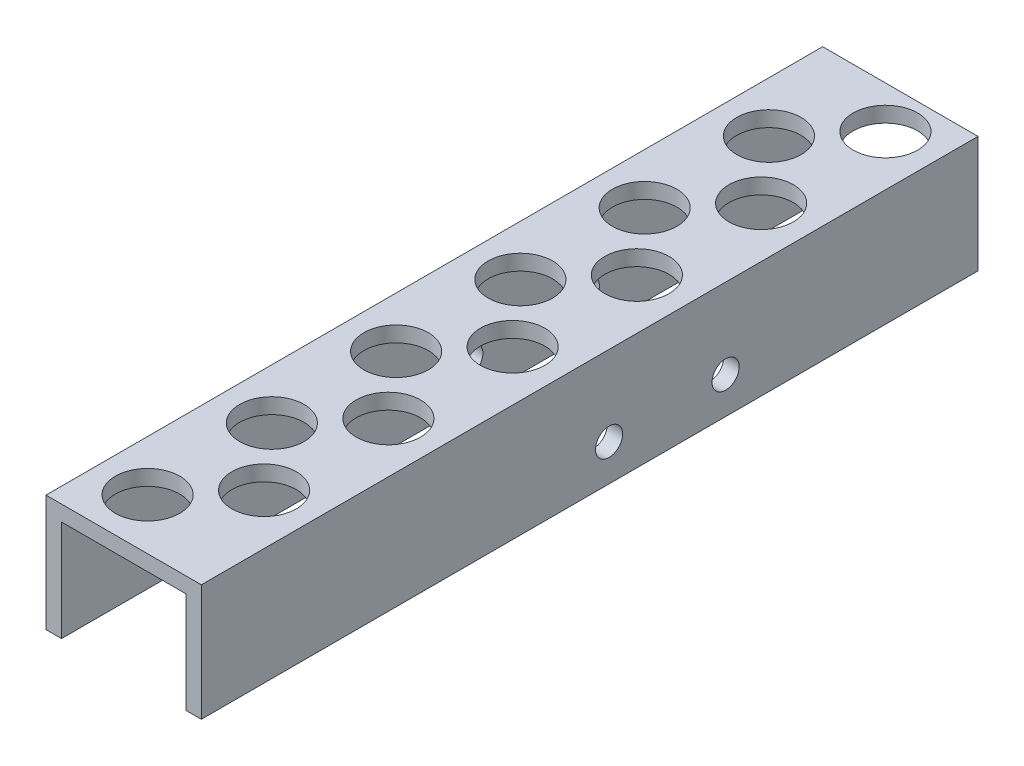
ISO-10303-21;
HEADER;
FILE_DESCRIPTION(('STEP AP214'),'2;1');
FILE_NAME('part.step','',(''),(''),'','','');
FILE_SCHEMA(('AUTOMOTIVE_DESIGN { 1 0 10303 214 1 1 1 1 }'));
ENDSEC;
DATA;
#1=APPLICATION_CONTEXT('core data for automotive mechanical design processes');
#2=APPLICATION_PROTOCOL_DEFINITION('international standard','automotive_design',2000,#1);
#3=PRODUCT_CONTEXT('',#1,'mechanical');
#4=PRODUCT('Part','Part','',(#3));
#5=PRODUCT_RELATED_PRODUCT_CATEGORY('part','',(#4));
#6=PRODUCT_DEFINITION_FORMATION('','',#4);
#7=PRODUCT_DEFINITION_CONTEXT('part definition',#1,'design');
#8=PRODUCT_DEFINITION('design','',#6,#7);
#9=PRODUCT_DEFINITION_SHAPE('','',#8);
#10=(LENGTH_UNIT() NAMED_UNIT(*) SI_UNIT(.MILLI.,.METRE.));
#11=(NAMED_UNIT(*) PLANE_ANGLE_UNIT() SI_UNIT($,.RADIAN.));
#12=(NAMED_UNIT(*) SI_UNIT($,.STERADIAN.) SOLID_ANGLE_UNIT());
#13=UNCERTAINTY_MEASURE_WITH_UNIT(LENGTH_MEASURE(1.E-05),#10,'distance_accuracy_value','');
#14=(GEOMETRIC_REPRESENTATION_CONTEXT(3) GLOBAL_UNCERTAINTY_ASSIGNED_CONTEXT((#13)) GLOBAL_UNIT_ASSIGNED_CONTEXT((#10,
#11,#12)) REPRESENTATION_CONTEXT('',''));
#15=CARTESIAN_POINT('',(0.,0.,0.));
#16=DIRECTION('',(0.,0.,1.));
#17=DIRECTION('',(1.,0.,0.));
#18=AXIS2_PLACEMENT_3D('',#15,#16,#17);
#19=CARTESIAN_POINT('',(-10.,-7.5,100.));
#20=DIRECTION('',(0.,1.,0.));
#21=DIRECTION('',(0.,0.,1.));
#22=AXIS2_PLACEMENT_3D('',#19,#20,#21);
#23=PLANE('',#22);
#24=DIRECTION('',(1.,0.,0.));
#25=VECTOR('',#24,1.);
#26=CARTESIAN_POINT('',(-10.,-7.5,100.));
#27=LINE('',#26,#25);
#28=CARTESIAN_POINT('',(8.,-7.5,100.));
#29=VERTEX_POINT('',#28);
#30=CARTESIAN_POINT('',(10.,-7.5,100.));
#31=VERTEX_POINT('',#30);
#32=EDGE_CURVE('E59',#29,#31,#27,.T.);
#33=ORIENTED_EDGE('',*,*,#32,.F.);
#34=DIRECTION('',(0.,0.,-1.));
#35=VECTOR('',#34,1.);
#36=CARTESIAN_POINT('',(8.,-7.5,100.));
#37=LINE('',#36,#35);
#38=CARTESIAN_POINT('',(8.,-7.5,0.));
#39=VERTEX_POINT('',#38);
#40=EDGE_CURVE('E110',#29,#39,#37,.T.);
#41=ORIENTED_EDGE('',*,*,#40,.T.);
#42=DIRECTION('',(1.,0.,0.));
#43=VECTOR('',#42,1.);
#44=CARTESIAN_POINT('',(-10.,-7.5,0.));
#45=LINE('',#44,#43);
#46=CARTESIAN_POINT('',(10.,-7.5,0.));
#47=VERTEX_POINT('',#46);
#48=EDGE_CURVE('E81',#39,#47,#45,.T.);
#49=ORIENTED_EDGE('',*,*,#48,.T.);
#50=DIRECTION('',(0.,0.,-1.));
#51=VECTOR('',#50,1.);
#52=CARTESIAN_POINT('',(10.,-7.5,100.));
#53=LINE('',#52,#51);
#54=EDGE_CURVE('E124',#31,#47,#53,.T.);
#55=ORIENTED_EDGE('',*,*,#54,.F.);
#56=EDGE_LOOP('',(#33,#41,#49,#55));
#57=FACE_BOUND('',#56,.T.);
#58=ADVANCED_FACE('F33',(#57),#23,.F.);
#59=CARTESIAN_POINT('',(10.,-7.5,100.));
#60=DIRECTION('',(-1.,0.,0.));
#61=DIRECTION('',(0.,0.,1.));
#62=AXIS2_PLACEMENT_3D('',#59,#60,#61);
#63=PLANE('',#62);
#64=CARTESIAN_POINT('',(10.,-2.8,47.5));
#65=DIRECTION('',(-1.,0.,0.));
#66=DIRECTION('',(0.,0.,1.));
#67=AXIS2_PLACEMENT_3D('',#64,#65,#66);
#68=CIRCLE('',#67,1.75);
#69=CARTESIAN_POINT('',(10.,-2.8,49.25));
#70=VERTEX_POINT('',#69);
#71=EDGE_CURVE('E160',#70,#70,#68,.T.);
#72=ORIENTED_EDGE('',*,*,#71,.T.);
#73=EDGE_LOOP('',(#72));
#74=FACE_BOUND('',#73,.T.);
#75=CARTESIAN_POINT('',(10.,-2.8,32.5));
#76=DIRECTION('',(-1.,0.,0.));
#77=DIRECTION('',(0.,0.,1.));
#78=AXIS2_PLACEMENT_3D('',#75,#76,#77);
#79=CIRCLE('',#78,1.75);
#80=CARTESIAN_POINT('',(10.,-2.8,34.25));
#81=VERTEX_POINT('',#80);
#82=EDGE_CURVE('E157',#81,#81,#79,.T.);
#83=ORIENTED_EDGE('',*,*,#82,.T.);
#84=EDGE_LOOP('',(#83));
#85=FACE_BOUND('',#84,.T.);
#86=DIRECTION('',(0.,1.,0.));
#87=VECTOR('',#86,1.);
#88=CARTESIAN_POINT('',(10.,-7.5,0.));
#89=LINE('',#88,#87);
#90=CARTESIAN_POINT('',(10.,7.5,0.));
#91=VERTEX_POINT('',#90);
#92=EDGE_CURVE('E133',#47,#91,#89,.T.);
#93=ORIENTED_EDGE('',*,*,#92,.T.);
#94=DIRECTION('',(0.,0.,-1.));
#95=VECTOR('',#94,1.);
#96=CARTESIAN_POINT('',(10.,7.5,100.));
#97=LINE('',#96,#95);
#98=CARTESIAN_POINT('',(10.,7.5,100.));
#99=VERTEX_POINT('',#98);
#100=EDGE_CURVE('E11',#99,#91,#97,.T.);
#101=ORIENTED_EDGE('',*,*,#100,.F.);
#102=DIRECTION('',(0.,1.,0.));
#103=VECTOR('',#102,1.);
#104=CARTESIAN_POINT('',(10.,-7.5,100.));
#105=LINE('',#104,#103);
#106=EDGE_CURVE('E144',#31,#99,#105,.T.);
#107=ORIENTED_EDGE('',*,*,#106,.F.);
#108=ORIENTED_EDGE('',*,*,#54,.T.);
#109=EDGE_LOOP('',(#93,#101,#107,#108));
#110=FACE_BOUND('',#109,.T.);
#111=ADVANCED_FACE('F35',(#74,#85,#110),#63,.F.);
#112=CARTESIAN_POINT('',(-10.,7.5,100.));
#113=DIRECTION('',(0.,-1.,0.));
#114=DIRECTION('',(0.,0.,-1.));
#115=AXIS2_PLACEMENT_3D('',#112,#113,#114);
#116=PLANE('',#115);
#117=CARTESIAN_POINT('',(-3.4999999999995,7.5,61.4191280685343));
#118=DIRECTION('',(0.,1.,0.));
#119=DIRECTION('',(0.,0.,1.));
#120=AXIS2_PLACEMENT_3D('',#117,#118,#119);
#121=CIRCLE('',#120,4.15);
#122=CARTESIAN_POINT('',(-3.4999999999995,7.5,65.5691280685343));
#123=VERTEX_POINT('',#122);
#124=EDGE_CURVE('E193',#123,#123,#121,.T.);
#125=ORIENTED_EDGE('',*,*,#124,.F.);
#126=EDGE_LOOP('',(#125));
#127=FACE_BOUND('',#126,.T.);
#128=CARTESIAN_POINT('',(3.50000000000067,7.5,69.4191280685343));
#129=DIRECTION('',(0.,1.,0.));
#130=DIRECTION('',(0.,0.,1.));
#131=AXIS2_PLACEMENT_3D('',#128,#129,#130);
#132=CIRCLE('',#131,4.15);
#133=CARTESIAN_POINT('',(3.50000000000067,7.5,73.5691280685343));
#134=VERTEX_POINT('',#133);
#135=EDGE_CURVE('E187',#134,#134,#132,.T.);
#136=ORIENTED_EDGE('',*,*,#135,.F.);
#137=EDGE_LOOP('',(#136));
#138=FACE_BOUND('',#137,.T.);
#139=CARTESIAN_POINT('',(3.5000000000005,7.5,53.4191280685343));
#140=DIRECTION('',(0.,1.,0.));
#141=DIRECTION('',(0.,0.,1.));
#142=AXIS2_PLACEMENT_3D('',#139,#140,#141);
#143=CIRCLE('',#142,4.15);
#144=CARTESIAN_POINT('',(3.5000000000005,7.5,57.5691280685343));
#145=VERTEX_POINT('',#144);
#146=EDGE_CURVE('E199',#145,#145,#143,.T.);
#147=ORIENTED_EDGE('',*,*,#146,.F.);
#148=EDGE_LOOP('',(#147));
#149=FACE_BOUND('',#148,.T.);
#150=CARTESIAN_POINT('',(3.50000000000083,7.5,85.4191280685343));
#151=DIRECTION('',(0.,1.,0.));
#152=DIRECTION('',(0.,0.,1.));
#153=AXIS2_PLACEMENT_3D('',#150,#151,#152);
#154=CIRCLE('',#153,4.15);
#155=CARTESIAN_POINT('',(3.50000000000083,7.5,89.5691280685343));
#156=VERTEX_POINT('',#155);
#157=EDGE_CURVE('E175',#156,#156,#154,.T.);
#158=ORIENTED_EDGE('',*,*,#157,.F.);
#159=EDGE_LOOP('',(#158));
#160=FACE_BOUND('',#159,.T.);
#161=CARTESIAN_POINT('',(-3.49999999999917,7.5,93.4191280685343));
#162=DIRECTION('',(0.,1.,0.));
#163=DIRECTION('',(0.,0.,1.));
#164=AXIS2_PLACEMENT_3D('',#161,#162,#163);
#165=CIRCLE('',#164,4.15);
#166=CARTESIAN_POINT('',(-3.49999999999917,7.5,97.5691280685343));
#167=VERTEX_POINT('',#166);
#168=EDGE_CURVE('E171',#167,#167,#165,.T.);
#169=ORIENTED_EDGE('',*,*,#168,.F.);
#170=EDGE_LOOP('',(#169));
#171=FACE_BOUND('',#170,.T.);
#172=CARTESIAN_POINT('',(-3.49999999999933,7.5,77.4191280685343));
#173=DIRECTION('',(0.,1.,0.));
#174=DIRECTION('',(0.,0.,1.));
#175=AXIS2_PLACEMENT_3D('',#172,#173,#174);
#176=CIRCLE('',#175,4.15);
#177=CARTESIAN_POINT('',(-3.49999999999933,7.5,81.5691280685343));
#178=VERTEX_POINT('',#177);
#179=EDGE_CURVE('E181',#178,#178,#176,.T.);
#180=ORIENTED_EDGE('',*,*,#179,.F.);
#181=EDGE_LOOP('',(#180));
#182=FACE_BOUND('',#181,.T.);
#183=CARTESIAN_POINT('',(3.50000000000016,7.5,21.4191280685343));
#184=DIRECTION('',(0.,1.,0.));
#185=DIRECTION('',(0.,0.,1.));
#186=AXIS2_PLACEMENT_3D('',#183,#184,#185);
#187=CIRCLE('',#186,4.15);
#188=CARTESIAN_POINT('',(3.50000000000016,7.5,25.5691280685343));
#189=VERTEX_POINT('',#188);
#190=EDGE_CURVE('E223',#189,#189,#187,.T.);
#191=ORIENTED_EDGE('',*,*,#190,.F.);
#192=EDGE_LOOP('',(#191));
#193=FACE_BOUND('',#192,.T.);
#194=CARTESIAN_POINT('',(-3.5,7.5,13.4191280685343));
#195=DIRECTION('',(0.,1.,0.));
#196=DIRECTION('',(0.,0.,1.));
#197=AXIS2_PLACEMENT_3D('',#194,#195,#196);
#198=CIRCLE('',#197,4.15);
#199=CARTESIAN_POINT('',(-3.5,7.5,17.5691280685343));
#200=VERTEX_POINT('',#199);
#201=EDGE_CURVE('E229',#200,#200,#198,.T.);
#202=ORIENTED_EDGE('',*,*,#201,.F.);
#203=EDGE_LOOP('',(#202));
#204=FACE_BOUND('',#203,.T.);
#205=CARTESIAN_POINT('',(3.50000000000033,7.5,37.4191280685343));
#206=DIRECTION('',(0.,1.,0.));
#207=DIRECTION('',(0.,0.,1.));
#208=AXIS2_PLACEMENT_3D('',#205,#206,#207);
#209=CIRCLE('',#208,4.15);
#210=CARTESIAN_POINT('',(3.50000000000033,7.5,41.5691280685343));
#211=VERTEX_POINT('',#210);
#212=EDGE_CURVE('E211',#211,#211,#209,.T.);
#213=ORIENTED_EDGE('',*,*,#212,.F.);
#214=EDGE_LOOP('',(#213));
#215=FACE_BOUND('',#214,.T.);
#216=CARTESIAN_POINT('',(-3.49999999999967,7.5,45.4191280685343));
#217=DIRECTION('',(0.,1.,0.));
#218=DIRECTION('',(0.,0.,1.));
#219=AXIS2_PLACEMENT_3D('',#216,#217,#218);
#220=CIRCLE('',#219,4.15);
#221=CARTESIAN_POINT('',(-3.49999999999967,7.5,49.5691280685343));
#222=VERTEX_POINT('',#221);
#223=EDGE_CURVE('E205',#222,#222,#220,.T.);
#224=ORIENTED_EDGE('',*,*,#223,.F.);
#225=EDGE_LOOP('',(#224));
#226=FACE_BOUND('',#225,.T.);
#227=CARTESIAN_POINT('',(-3.49999999999984,7.5,29.4191280685343));
#228=DIRECTION('',(0.,1.,0.));
#229=DIRECTION('',(0.,0.,1.));
#230=AXIS2_PLACEMENT_3D('',#227,#228,#229);
#231=CIRCLE('',#230,4.15);
#232=CARTESIAN_POINT('',(-3.49999999999984,7.5,33.5691280685343));
#233=VERTEX_POINT('',#232);
#234=EDGE_CURVE('E217',#233,#233,#231,.T.);
#235=ORIENTED_EDGE('',*,*,#234,.F.);
#236=EDGE_LOOP('',(#235));
#237=FACE_BOUND('',#236,.T.);
#238=CARTESIAN_POINT('',(3.5,7.5,5.41912806853429));
#239=DIRECTION('',(0.,1.,0.));
#240=DIRECTION('',(0.,0.,1.));
#241=AXIS2_PLACEMENT_3D('',#238,#239,#240);
#242=CIRCLE('',#241,4.15);
#243=CARTESIAN_POINT('',(3.5,7.5,9.56912806853429));
#244=VERTEX_POINT('',#243);
#245=EDGE_CURVE('E235',#244,#244,#242,.T.);
#246=ORIENTED_EDGE('',*,*,#245,.F.);
#247=EDGE_LOOP('',(#246));
#248=FACE_BOUND('',#247,.T.);
#249=DIRECTION('',(-1.,0.,0.));
#250=VECTOR('',#249,1.);
#251=CARTESIAN_POINT('',(-10.,7.5,0.));
#252=LINE('',#251,#250);
#253=CARTESIAN_POINT('',(-10.,7.5,0.));
#254=VERTEX_POINT('',#253);
#255=EDGE_CURVE('E136',#91,#254,#252,.T.);
#256=ORIENTED_EDGE('',*,*,#255,.T.);
#257=DIRECTION('',(0.,0.,-1.));
#258=VECTOR('',#257,1.);
#259=CARTESIAN_POINT('',(-10.,7.5,100.));
#260=LINE('',#259,#258);
#261=CARTESIAN_POINT('',(-10.,7.5,100.));
#262=VERTEX_POINT('',#261);
#263=EDGE_CURVE('E42',#262,#254,#260,.T.);
#264=ORIENTED_EDGE('',*,*,#263,.F.);
#265=DIRECTION('',(-1.,0.,0.));
#266=VECTOR('',#265,1.);
#267=CARTESIAN_POINT('',(-10.,7.5,100.));
#268=LINE('',#267,#266);
#269=EDGE_CURVE('E88',#99,#262,#268,.T.);
#270=ORIENTED_EDGE('',*,*,#269,.F.);
#271=ORIENTED_EDGE('',*,*,#100,.T.);
#272=EDGE_LOOP('',(#256,#264,#270,#271));
#273=FACE_BOUND('',#272,.T.);
#274=ADVANCED_FACE('F257',(#127,#138,#149,#160,#171,#182,#193,#204,#215,#226,#237,#248,#273),
#116,.F.);
#275=CARTESIAN_POINT('',(-10.,-7.5,100.));
#276=DIRECTION('',(1.,0.,0.));
#277=DIRECTION('',(0.,0.,-1.));
#278=AXIS2_PLACEMENT_3D('',#275,#276,#277);
#279=PLANE('',#278);
#280=CARTESIAN_POINT('',(-10.,-2.8,47.5));
#281=DIRECTION('',(1.,0.,0.));
#282=DIRECTION('',(0.,0.,-1.));
#283=AXIS2_PLACEMENT_3D('',#280,#281,#282);
#284=CIRCLE('',#283,1.75);
#285=CARTESIAN_POINT('',(-10.,-2.8,45.75));
#286=VERTEX_POINT('',#285);
#287=EDGE_CURVE('E369',#286,#286,#284,.T.);
#288=ORIENTED_EDGE('',*,*,#287,.T.);
#289=EDGE_LOOP('',(#288));
#290=FACE_BOUND('',#289,.T.);
#291=CARTESIAN_POINT('',(-10.,-2.8,32.5));
#292=DIRECTION('',(1.,0.,0.));
#293=DIRECTION('',(0.,0.,-1.));
#294=AXIS2_PLACEMENT_3D('',#291,#292,#293);
#295=CIRCLE('',#294,1.75);
#296=CARTESIAN_POINT('',(-10.,-2.8,30.75));
#297=VERTEX_POINT('',#296);
#298=EDGE_CURVE('E153',#297,#297,#295,.T.);
#299=ORIENTED_EDGE('',*,*,#298,.T.);
#300=EDGE_LOOP('',(#299));
#301=FACE_BOUND('',#300,.T.);
#302=DIRECTION('',(0.,-1.,0.));
#303=VECTOR('',#302,1.);
#304=CARTESIAN_POINT('',(-10.,-7.5,0.));
#305=LINE('',#304,#303);
#306=CARTESIAN_POINT('',(-10.,-7.5,0.));
#307=VERTEX_POINT('',#306);
#308=EDGE_CURVE('E139',#254,#307,#305,.T.);
#309=ORIENTED_EDGE('',*,*,#308,.T.);
#310=DIRECTION('',(0.,0.,-1.));
#311=VECTOR('',#310,1.);
#312=CARTESIAN_POINT('',(-10.,-7.5,100.));
#313=LINE('',#312,#311);
#314=CARTESIAN_POINT('',(-10.,-7.5,100.));
#315=VERTEX_POINT('',#314);
#316=EDGE_CURVE('E146',#315,#307,#313,.T.);
#317=ORIENTED_EDGE('',*,*,#316,.F.);
#318=DIRECTION('',(0.,-1.,0.));
#319=VECTOR('',#318,1.);
#320=CARTESIAN_POINT('',(-10.,-7.5,100.));
#321=LINE('',#320,#319);
#322=EDGE_CURVE('E127',#262,#315,#321,.T.);
#323=ORIENTED_EDGE('',*,*,#322,.F.);
#324=ORIENTED_EDGE('',*,*,#263,.T.);
#325=EDGE_LOOP('',(#309,#317,#323,#324));
#326=FACE_BOUND('',#325,.T.);
#327=ADVANCED_FACE('F260',(#290,#301,#326),#279,.F.);
#328=CARTESIAN_POINT('',(-8.,-7.5,0.));
#329=VERTEX_POINT('',#328);
#330=EDGE_CURVE('E141',#307,#329,#45,.T.);
#331=ORIENTED_EDGE('',*,*,#330,.T.);
#332=DIRECTION('',(0.,0.,-1.));
#333=VECTOR('',#332,1.);
#334=CARTESIAN_POINT('',(-8.,-7.5,100.));
#335=LINE('',#334,#333);
#336=CARTESIAN_POINT('',(-8.,-7.5,100.));
#337=VERTEX_POINT('',#336);
#338=EDGE_CURVE('E50',#337,#329,#335,.T.);
#339=ORIENTED_EDGE('',*,*,#338,.F.);
#340=EDGE_CURVE('E126',#315,#337,#27,.T.);
#341=ORIENTED_EDGE('',*,*,#340,.F.);
#342=ORIENTED_EDGE('',*,*,#316,.T.);
#343=EDGE_LOOP('',(#331,#339,#341,#342));
#344=FACE_BOUND('',#343,.T.);
#345=ADVANCED_FACE('F264',(#344),#23,.F.);
#346=CARTESIAN_POINT('',(0.,0.,100.));
#347=DIRECTION('',(0.,0.,-1.));
#348=DIRECTION('',(-1.,0.,0.));
#349=AXIS2_PLACEMENT_3D('',#346,#347,#348);
#350=PLANE('',#349);
#351=DIRECTION('',(1.,0.,0.));
#352=VECTOR('',#351,1.);
#353=CARTESIAN_POINT('',(8.,5.5,100.));
#354=LINE('',#353,#352);
#355=CARTESIAN_POINT('',(-8.,5.5,100.));
#356=VERTEX_POINT('',#355);
#357=CARTESIAN_POINT('',(8.,5.5,100.));
#358=VERTEX_POINT('',#357);
#359=EDGE_CURVE('E116',#356,#358,#354,.T.);
#360=ORIENTED_EDGE('',*,*,#359,.T.);
#361=DIRECTION('',(0.,-1.,0.));
#362=VECTOR('',#361,1.);
#363=CARTESIAN_POINT('',(8.,-7.5,100.));
#364=LINE('',#363,#362);
#365=EDGE_CURVE('E112',#358,#29,#364,.T.);
#366=ORIENTED_EDGE('',*,*,#365,.T.);
#367=ORIENTED_EDGE('',*,*,#32,.T.);
#368=ORIENTED_EDGE('',*,*,#106,.T.);
#369=ORIENTED_EDGE('',*,*,#269,.T.);
#370=ORIENTED_EDGE('',*,*,#322,.T.);
#371=ORIENTED_EDGE('',*,*,#340,.T.);
#372=DIRECTION('',(0.,1.,0.));
#373=VECTOR('',#372,1.);
#374=CARTESIAN_POINT('',(-8.,-7.5,100.));
#375=LINE('',#374,#373);
#376=EDGE_CURVE('E121',#337,#356,#375,.T.);
#377=ORIENTED_EDGE('',*,*,#376,.T.);
#378=EDGE_LOOP('',(#360,#366,#367,#368,#369,#370,#371,#377));
#379=FACE_BOUND('',#378,.T.);
#380=ADVANCED_FACE('F118',(#379),#350,.F.);
#381=CARTESIAN_POINT('',(0.,0.,0.));
#382=DIRECTION('',(0.,0.,-1.));
#383=DIRECTION('',(-1.,0.,0.));
#384=AXIS2_PLACEMENT_3D('',#381,#382,#383);
#385=PLANE('',#384);
#386=DIRECTION('',(0.,-1.,0.));
#387=VECTOR('',#386,1.);
#388=CARTESIAN_POINT('',(8.,-7.5,0.));
#389=LINE('',#388,#387);
#390=CARTESIAN_POINT('',(8.,5.5,0.));
#391=VERTEX_POINT('',#390);
#392=EDGE_CURVE('E115',#391,#39,#389,.T.);
#393=ORIENTED_EDGE('',*,*,#392,.F.);
#394=DIRECTION('',(1.,0.,0.));
#395=VECTOR('',#394,1.);
#396=CARTESIAN_POINT('',(8.,5.5,0.));
#397=LINE('',#396,#395);
#398=CARTESIAN_POINT('',(-8.,5.5,0.));
#399=VERTEX_POINT('',#398);
#400=EDGE_CURVE('E122',#399,#391,#397,.T.);
#401=ORIENTED_EDGE('',*,*,#400,.F.);
#402=DIRECTION('',(0.,1.,0.));
#403=VECTOR('',#402,1.);
#404=CARTESIAN_POINT('',(-8.,-7.5,0.));
#405=LINE('',#404,#403);
#406=EDGE_CURVE('E246',#329,#399,#405,.T.);
#407=ORIENTED_EDGE('',*,*,#406,.F.);
#408=ORIENTED_EDGE('',*,*,#330,.F.);
#409=ORIENTED_EDGE('',*,*,#308,.F.);
#410=ORIENTED_EDGE('',*,*,#255,.F.);
#411=ORIENTED_EDGE('',*,*,#92,.F.);
#412=ORIENTED_EDGE('',*,*,#48,.F.);
#413=EDGE_LOOP('',(#393,#401,#407,#408,#409,#410,#411,#412));
#414=FACE_BOUND('',#413,.T.);
#415=ADVANCED_FACE('F270',(#414),#385,.T.);
#416=CARTESIAN_POINT('',(8.,-7.5,100.));
#417=DIRECTION('',(1.,0.,0.));
#418=DIRECTION('',(0.,1.,0.));
#419=AXIS2_PLACEMENT_3D('',#416,#417,#418);
#420=PLANE('',#419);
#421=CARTESIAN_POINT('',(8.,-2.8,47.5));
#422=DIRECTION('',(1.,0.,0.));
#423=DIRECTION('',(0.,1.,0.));
#424=AXIS2_PLACEMENT_3D('',#421,#422,#423);
#425=CIRCLE('',#424,1.75);
#426=CARTESIAN_POINT('',(8.,-1.05,47.5));
#427=VERTEX_POINT('',#426);
#428=EDGE_CURVE('E165',#427,#427,#425,.T.);
#429=ORIENTED_EDGE('',*,*,#428,.T.);
#430=EDGE_LOOP('',(#429));
#431=FACE_BOUND('',#430,.T.);
#432=CARTESIAN_POINT('',(8.,-2.8,32.5));
#433=DIRECTION('',(1.,0.,0.));
#434=DIRECTION('',(0.,1.,0.));
#435=AXIS2_PLACEMENT_3D('',#432,#433,#434);
#436=CIRCLE('',#435,1.75);
#437=CARTESIAN_POINT('',(8.,-1.05,32.5));
#438=VERTEX_POINT('',#437);
#439=EDGE_CURVE('E152',#438,#438,#436,.T.);
#440=ORIENTED_EDGE('',*,*,#439,.T.);
#441=EDGE_LOOP('',(#440));
#442=FACE_BOUND('',#441,.T.);
#443=ORIENTED_EDGE('',*,*,#392,.T.);
#444=ORIENTED_EDGE('',*,*,#40,.F.);
#445=ORIENTED_EDGE('',*,*,#365,.F.);
#446=DIRECTION('',(0.,0.,-1.));
#447=VECTOR('',#446,1.);
#448=CARTESIAN_POINT('',(8.,5.5,100.));
#449=LINE('',#448,#447);
#450=EDGE_CURVE('E137',#358,#391,#449,.T.);
#451=ORIENTED_EDGE('',*,*,#450,.T.);
#452=EDGE_LOOP('',(#443,#444,#445,#451));
#453=FACE_BOUND('',#452,.T.);
#454=ADVANCED_FACE('F111',(#431,#442,#453),#420,.F.);
#455=CARTESIAN_POINT('',(8.,5.5,100.));
#456=DIRECTION('',(0.,1.,0.));
#457=DIRECTION('',(-1.,0.,0.));
#458=AXIS2_PLACEMENT_3D('',#455,#456,#457);
#459=PLANE('',#458);
#460=CARTESIAN_POINT('',(-3.4999999999995,5.5,61.4191280685343));
#461=DIRECTION('',(0.,1.,0.));
#462=DIRECTION('',(0.,0.,1.));
#463=AXIS2_PLACEMENT_3D('',#460,#461,#462);
#464=CIRCLE('',#463,4.15);
#465=CARTESIAN_POINT('',(-3.4999999999995,5.5,65.5691280685343));
#466=VERTEX_POINT('',#465);
#467=EDGE_CURVE('E196',#466,#466,#464,.T.);
#468=ORIENTED_EDGE('',*,*,#467,.T.);
#469=EDGE_LOOP('',(#468));
#470=FACE_BOUND('',#469,.T.);
#471=CARTESIAN_POINT('',(3.50000000000067,5.5,69.4191280685343));
#472=DIRECTION('',(0.,1.,0.));
#473=DIRECTION('',(0.,0.,1.));
#474=AXIS2_PLACEMENT_3D('',#471,#472,#473);
#475=CIRCLE('',#474,4.15);
#476=CARTESIAN_POINT('',(3.50000000000067,5.5,73.5691280685343));
#477=VERTEX_POINT('',#476);
#478=EDGE_CURVE('E190',#477,#477,#475,.T.);
#479=ORIENTED_EDGE('',*,*,#478,.T.);
#480=EDGE_LOOP('',(#479));
#481=FACE_BOUND('',#480,.T.);
#482=CARTESIAN_POINT('',(3.5000000000005,5.5,53.4191280685343));
#483=DIRECTION('',(0.,1.,0.));
#484=DIRECTION('',(0.,0.,1.));
#485=AXIS2_PLACEMENT_3D('',#482,#483,#484);
#486=CIRCLE('',#485,4.15);
#487=CARTESIAN_POINT('',(3.5000000000005,5.5,57.5691280685343));
#488=VERTEX_POINT('',#487);
#489=EDGE_CURVE('E202',#488,#488,#486,.T.);
#490=ORIENTED_EDGE('',*,*,#489,.T.);
#491=EDGE_LOOP('',(#490));
#492=FACE_BOUND('',#491,.T.);
#493=CARTESIAN_POINT('',(3.50000000000083,5.5,85.4191280685343));
#494=DIRECTION('',(0.,1.,0.));
#495=DIRECTION('',(0.,0.,1.));
#496=AXIS2_PLACEMENT_3D('',#493,#494,#495);
#497=CIRCLE('',#496,4.15);
#498=CARTESIAN_POINT('',(3.50000000000083,5.5,89.5691280685343));
#499=VERTEX_POINT('',#498);
#500=EDGE_CURVE('E178',#499,#499,#497,.T.);
#501=ORIENTED_EDGE('',*,*,#500,.T.);
#502=EDGE_LOOP('',(#501));
#503=FACE_BOUND('',#502,.T.);
#504=CARTESIAN_POINT('',(-3.49999999999917,5.5,93.4191280685343));
#505=DIRECTION('',(0.,1.,0.));
#506=DIRECTION('',(0.,0.,1.));
#507=AXIS2_PLACEMENT_3D('',#504,#505,#506);
#508=CIRCLE('',#507,4.15);
#509=CARTESIAN_POINT('',(-3.49999999999917,5.5,97.5691280685343));
#510=VERTEX_POINT('',#509);
#511=EDGE_CURVE('E172',#510,#510,#508,.T.);
#512=ORIENTED_EDGE('',*,*,#511,.T.);
#513=EDGE_LOOP('',(#512));
#514=FACE_BOUND('',#513,.T.);
#515=CARTESIAN_POINT('',(-3.49999999999933,5.5,77.4191280685343));
#516=DIRECTION('',(0.,1.,0.));
#517=DIRECTION('',(0.,0.,1.));
#518=AXIS2_PLACEMENT_3D('',#515,#516,#517);
#519=CIRCLE('',#518,4.15);
#520=CARTESIAN_POINT('',(-3.49999999999933,5.5,81.5691280685343));
#521=VERTEX_POINT('',#520);
#522=EDGE_CURVE('E184',#521,#521,#519,.T.);
#523=ORIENTED_EDGE('',*,*,#522,.T.);
#524=EDGE_LOOP('',(#523));
#525=FACE_BOUND('',#524,.T.);
#526=CARTESIAN_POINT('',(3.50000000000016,5.5,21.4191280685343));
#527=DIRECTION('',(0.,1.,0.));
#528=DIRECTION('',(0.,0.,1.));
#529=AXIS2_PLACEMENT_3D('',#526,#527,#528);
#530=CIRCLE('',#529,4.15);
#531=CARTESIAN_POINT('',(3.50000000000016,5.5,25.5691280685343));
#532=VERTEX_POINT('',#531);
#533=EDGE_CURVE('E226',#532,#532,#530,.T.);
#534=ORIENTED_EDGE('',*,*,#533,.T.);
#535=EDGE_LOOP('',(#534));
#536=FACE_BOUND('',#535,.T.);
#537=CARTESIAN_POINT('',(-3.5,5.5,13.4191280685343));
#538=DIRECTION('',(0.,1.,0.));
#539=DIRECTION('',(0.,0.,1.));
#540=AXIS2_PLACEMENT_3D('',#537,#538,#539);
#541=CIRCLE('',#540,4.15);
#542=CARTESIAN_POINT('',(-3.5,5.5,17.5691280685343));
#543=VERTEX_POINT('',#542);
#544=EDGE_CURVE('E232',#543,#543,#541,.T.);
#545=ORIENTED_EDGE('',*,*,#544,.T.);
#546=EDGE_LOOP('',(#545));
#547=FACE_BOUND('',#546,.T.);
#548=CARTESIAN_POINT('',(3.50000000000033,5.5,37.4191280685343));
#549=DIRECTION('',(0.,1.,0.));
#550=DIRECTION('',(0.,0.,1.));
#551=AXIS2_PLACEMENT_3D('',#548,#549,#550);
#552=CIRCLE('',#551,4.15);
#553=CARTESIAN_POINT('',(3.50000000000033,5.5,41.5691280685343));
#554=VERTEX_POINT('',#553);
#555=EDGE_CURVE('E214',#554,#554,#552,.T.);
#556=ORIENTED_EDGE('',*,*,#555,.T.);
#557=EDGE_LOOP('',(#556));
#558=FACE_BOUND('',#557,.T.);
#559=CARTESIAN_POINT('',(-3.49999999999967,5.5,45.4191280685343));
#560=DIRECTION('',(0.,1.,0.));
#561=DIRECTION('',(0.,0.,1.));
#562=AXIS2_PLACEMENT_3D('',#559,#560,#561);
#563=CIRCLE('',#562,4.15);
#564=CARTESIAN_POINT('',(-3.49999999999967,5.5,49.5691280685343));
#565=VERTEX_POINT('',#564);
#566=EDGE_CURVE('E208',#565,#565,#563,.T.);
#567=ORIENTED_EDGE('',*,*,#566,.T.);
#568=EDGE_LOOP('',(#567));
#569=FACE_BOUND('',#568,.T.);
#570=CARTESIAN_POINT('',(-3.49999999999984,5.5,29.4191280685343));
#571=DIRECTION('',(0.,1.,0.));
#572=DIRECTION('',(0.,0.,1.));
#573=AXIS2_PLACEMENT_3D('',#570,#571,#572);
#574=CIRCLE('',#573,4.15);
#575=CARTESIAN_POINT('',(-3.49999999999984,5.5,33.5691280685343));
#576=VERTEX_POINT('',#575);
#577=EDGE_CURVE('E220',#576,#576,#574,.T.);
#578=ORIENTED_EDGE('',*,*,#577,.T.);
#579=EDGE_LOOP('',(#578));
#580=FACE_BOUND('',#579,.T.);
#581=CARTESIAN_POINT('',(3.5,5.5,5.41912806853429));
#582=DIRECTION('',(0.,1.,0.));
#583=DIRECTION('',(0.,0.,1.));
#584=AXIS2_PLACEMENT_3D('',#581,#582,#583);
#585=CIRCLE('',#584,4.15);
#586=CARTESIAN_POINT('',(3.5,5.5,9.56912806853429));
#587=VERTEX_POINT('',#586);
#588=EDGE_CURVE('E238',#587,#587,#585,.T.);
#589=ORIENTED_EDGE('',*,*,#588,.T.);
#590=EDGE_LOOP('',(#589));
#591=FACE_BOUND('',#590,.T.);
#592=ORIENTED_EDGE('',*,*,#400,.T.);
#593=ORIENTED_EDGE('',*,*,#450,.F.);
#594=ORIENTED_EDGE('',*,*,#359,.F.);
#595=DIRECTION('',(0.,0.,-1.));
#596=VECTOR('',#595,1.);
#597=CARTESIAN_POINT('',(-8.,5.5,100.));
#598=LINE('',#597,#596);
#599=EDGE_CURVE('E251',#356,#399,#598,.T.);
#600=ORIENTED_EDGE('',*,*,#599,.T.);
#601=EDGE_LOOP('',(#592,#593,#594,#600));
#602=FACE_BOUND('',#601,.T.);
#603=ADVANCED_FACE('F268',(#470,#481,#492,#503,#514,#525,#536,#547,#558,#569,#580,#591,#602),
#459,.F.);
#604=CARTESIAN_POINT('',(-8.,-7.5,100.));
#605=DIRECTION('',(-1.,0.,0.));
#606=DIRECTION('',(0.,0.,1.));
#607=AXIS2_PLACEMENT_3D('',#604,#605,#606);
#608=PLANE('',#607);
#609=CARTESIAN_POINT('',(-8.,-2.8,47.5));
#610=DIRECTION('',(-1.,0.,0.));
#611=DIRECTION('',(0.,0.,1.));
#612=AXIS2_PLACEMENT_3D('',#609,#610,#611);
#613=CIRCLE('',#612,1.75);
#614=CARTESIAN_POINT('',(-8.,-2.8,49.25));
#615=VERTEX_POINT('',#614);
#616=EDGE_CURVE('E37',#615,#615,#613,.T.);
#617=ORIENTED_EDGE('',*,*,#616,.T.);
#618=EDGE_LOOP('',(#617));
#619=FACE_BOUND('',#618,.T.);
#620=CARTESIAN_POINT('',(-8.,-2.8,32.5));
#621=DIRECTION('',(-1.,0.,0.));
#622=DIRECTION('',(0.,0.,1.));
#623=AXIS2_PLACEMENT_3D('',#620,#621,#622);
#624=CIRCLE('',#623,1.75);
#625=CARTESIAN_POINT('',(-8.,-2.8,34.25));
#626=VERTEX_POINT('',#625);
#627=EDGE_CURVE('E150',#626,#626,#624,.T.);
#628=ORIENTED_EDGE('',*,*,#627,.T.);
#629=EDGE_LOOP('',(#628));
#630=FACE_BOUND('',#629,.T.);
#631=ORIENTED_EDGE('',*,*,#406,.T.);
#632=ORIENTED_EDGE('',*,*,#599,.F.);
#633=ORIENTED_EDGE('',*,*,#376,.F.);
#634=ORIENTED_EDGE('',*,*,#338,.T.);
#635=EDGE_LOOP('',(#631,#632,#633,#634));
#636=FACE_BOUND('',#635,.T.);
#637=ADVANCED_FACE('F265',(#619,#630,#636),#608,.F.);
#638=CARTESIAN_POINT('',(3.5,5.5,5.41912806853429));
#639=DIRECTION('',(0.,1.,0.));
#640=DIRECTION('',(0.,0.,1.));
#641=AXIS2_PLACEMENT_3D('',#638,#639,#640);
#642=CYLINDRICAL_SURFACE('',#641,4.15);
#643=ORIENTED_EDGE('',*,*,#588,.F.);
#644=EDGE_LOOP('',(#643));
#645=FACE_BOUND('',#644,.T.);
#646=ORIENTED_EDGE('',*,*,#245,.T.);
#647=EDGE_LOOP('',(#646));
#648=FACE_BOUND('',#647,.T.);
#649=ADVANCED_FACE('F338',(#645,#648),#642,.F.);
#650=CARTESIAN_POINT('',(-3.49999999999984,5.5,29.4191280685343));
#651=DIRECTION('',(0.,1.,0.));
#652=DIRECTION('',(0.,0.,1.));
#653=AXIS2_PLACEMENT_3D('',#650,#651,#652);
#654=CYLINDRICAL_SURFACE('',#653,4.15);
#655=ORIENTED_EDGE('',*,*,#577,.F.);
#656=EDGE_LOOP('',(#655));
#657=FACE_BOUND('',#656,.T.);
#658=ORIENTED_EDGE('',*,*,#234,.T.);
#659=EDGE_LOOP('',(#658));
#660=FACE_BOUND('',#659,.T.);
#661=ADVANCED_FACE('F330',(#657,#660),#654,.F.);
#662=CARTESIAN_POINT('',(-3.49999999999967,5.5,45.4191280685343));
#663=DIRECTION('',(0.,1.,0.));
#664=DIRECTION('',(0.,0.,1.));
#665=AXIS2_PLACEMENT_3D('',#662,#663,#664);
#666=CYLINDRICAL_SURFACE('',#665,4.15);
#667=ORIENTED_EDGE('',*,*,#566,.F.);
#668=EDGE_LOOP('',(#667));
#669=FACE_BOUND('',#668,.T.);
#670=ORIENTED_EDGE('',*,*,#223,.T.);
#671=EDGE_LOOP('',(#670));
#672=FACE_BOUND('',#671,.T.);
#673=ADVANCED_FACE('F326',(#669,#672),#666,.F.);
#674=CARTESIAN_POINT('',(3.50000000000033,5.5,37.4191280685343));
#675=DIRECTION('',(0.,1.,0.));
#676=DIRECTION('',(0.,0.,1.));
#677=AXIS2_PLACEMENT_3D('',#674,#675,#676);
#678=CYLINDRICAL_SURFACE('',#677,4.15);
#679=ORIENTED_EDGE('',*,*,#555,.F.);
#680=EDGE_LOOP('',(#679));
#681=FACE_BOUND('',#680,.T.);
#682=ORIENTED_EDGE('',*,*,#212,.T.);
#683=EDGE_LOOP('',(#682));
#684=FACE_BOUND('',#683,.T.);
#685=ADVANCED_FACE('F329',(#681,#684),#678,.F.);
#686=CARTESIAN_POINT('',(-3.5,5.5,13.4191280685343));
#687=DIRECTION('',(0.,1.,0.));
#688=DIRECTION('',(0.,0.,1.));
#689=AXIS2_PLACEMENT_3D('',#686,#687,#688);
#690=CYLINDRICAL_SURFACE('',#689,4.15);
#691=ORIENTED_EDGE('',*,*,#544,.F.);
#692=EDGE_LOOP('',(#691));
#693=FACE_BOUND('',#692,.T.);
#694=ORIENTED_EDGE('',*,*,#201,.T.);
#695=EDGE_LOOP('',(#694));
#696=FACE_BOUND('',#695,.T.);
#697=ADVANCED_FACE('F334',(#693,#696),#690,.F.);
#698=CARTESIAN_POINT('',(3.50000000000016,5.5,21.4191280685343));
#699=DIRECTION('',(0.,1.,0.));
#700=DIRECTION('',(0.,0.,1.));
#701=AXIS2_PLACEMENT_3D('',#698,#699,#700);
#702=CYLINDRICAL_SURFACE('',#701,4.15);
#703=ORIENTED_EDGE('',*,*,#533,.F.);
#704=EDGE_LOOP('',(#703));
#705=FACE_BOUND('',#704,.T.);
#706=ORIENTED_EDGE('',*,*,#190,.T.);
#707=EDGE_LOOP('',(#706));
#708=FACE_BOUND('',#707,.T.);
#709=ADVANCED_FACE('F314',(#705,#708),#702,.F.);
#710=CARTESIAN_POINT('',(-3.49999999999933,5.5,77.4191280685343));
#711=DIRECTION('',(0.,1.,0.));
#712=DIRECTION('',(0.,0.,1.));
#713=AXIS2_PLACEMENT_3D('',#710,#711,#712);
#714=CYLINDRICAL_SURFACE('',#713,4.15);
#715=ORIENTED_EDGE('',*,*,#522,.F.);
#716=EDGE_LOOP('',(#715));
#717=FACE_BOUND('',#716,.T.);
#718=ORIENTED_EDGE('',*,*,#179,.T.);
#719=EDGE_LOOP('',(#718));
#720=FACE_BOUND('',#719,.T.);
#721=ADVANCED_FACE('F306',(#717,#720),#714,.F.);
#722=CARTESIAN_POINT('',(-3.49999999999917,5.5,93.4191280685343));
#723=DIRECTION('',(0.,1.,0.));
#724=DIRECTION('',(0.,0.,1.));
#725=AXIS2_PLACEMENT_3D('',#722,#723,#724);
#726=CYLINDRICAL_SURFACE('',#725,4.15);
#727=ORIENTED_EDGE('',*,*,#511,.F.);
#728=EDGE_LOOP('',(#727));
#729=FACE_BOUND('',#728,.T.);
#730=ORIENTED_EDGE('',*,*,#168,.T.);
#731=EDGE_LOOP('',(#730));
#732=FACE_BOUND('',#731,.T.);
#733=ADVANCED_FACE('F302',(#729,#732),#726,.F.);
#734=CARTESIAN_POINT('',(3.50000000000083,5.5,85.4191280685343));
#735=DIRECTION('',(0.,1.,0.));
#736=DIRECTION('',(0.,0.,1.));
#737=AXIS2_PLACEMENT_3D('',#734,#735,#736);
#738=CYLINDRICAL_SURFACE('',#737,4.15);
#739=ORIENTED_EDGE('',*,*,#500,.F.);
#740=EDGE_LOOP('',(#739));
#741=FACE_BOUND('',#740,.T.);
#742=ORIENTED_EDGE('',*,*,#157,.T.);
#743=EDGE_LOOP('',(#742));
#744=FACE_BOUND('',#743,.T.);
#745=ADVANCED_FACE('F305',(#741,#744),#738,.F.);
#746=CARTESIAN_POINT('',(3.5000000000005,5.5,53.4191280685343));
#747=DIRECTION('',(0.,1.,0.));
#748=DIRECTION('',(0.,0.,1.));
#749=AXIS2_PLACEMENT_3D('',#746,#747,#748);
#750=CYLINDRICAL_SURFACE('',#749,4.15);
#751=ORIENTED_EDGE('',*,*,#489,.F.);
#752=EDGE_LOOP('',(#751));
#753=FACE_BOUND('',#752,.T.);
#754=ORIENTED_EDGE('',*,*,#146,.T.);
#755=EDGE_LOOP('',(#754));
#756=FACE_BOUND('',#755,.T.);
#757=ADVANCED_FACE('F310',(#753,#756),#750,.F.);
#758=CARTESIAN_POINT('',(3.50000000000067,5.5,69.4191280685343));
#759=DIRECTION('',(0.,1.,0.));
#760=DIRECTION('',(0.,0.,1.));
#761=AXIS2_PLACEMENT_3D('',#758,#759,#760);
#762=CYLINDRICAL_SURFACE('',#761,4.15);
#763=ORIENTED_EDGE('',*,*,#478,.F.);
#764=EDGE_LOOP('',(#763));
#765=FACE_BOUND('',#764,.T.);
#766=ORIENTED_EDGE('',*,*,#135,.T.);
#767=EDGE_LOOP('',(#766));
#768=FACE_BOUND('',#767,.T.);
#769=ADVANCED_FACE('F316',(#765,#768),#762,.F.);
#770=CARTESIAN_POINT('',(-3.4999999999995,5.5,61.4191280685343));
#771=DIRECTION('',(0.,1.,0.));
#772=DIRECTION('',(0.,0.,1.));
#773=AXIS2_PLACEMENT_3D('',#770,#771,#772);
#774=CYLINDRICAL_SURFACE('',#773,4.15);
#775=ORIENTED_EDGE('',*,*,#467,.F.);
#776=EDGE_LOOP('',(#775));
#777=FACE_BOUND('',#776,.T.);
#778=ORIENTED_EDGE('',*,*,#124,.T.);
#779=EDGE_LOOP('',(#778));
#780=FACE_BOUND('',#779,.T.);
#781=ADVANCED_FACE('F298',(#777,#780),#774,.F.);
#782=CARTESIAN_POINT('',(-10.,-2.8,32.5));
#783=DIRECTION('',(1.,0.,0.));
#784=DIRECTION('',(0.,0.,-1.));
#785=AXIS2_PLACEMENT_3D('',#782,#783,#784);
#786=CYLINDRICAL_SURFACE('',#785,1.75);
#787=ORIENTED_EDGE('',*,*,#298,.F.);
#788=EDGE_LOOP('',(#787));
#789=FACE_BOUND('',#788,.T.);
#790=ORIENTED_EDGE('',*,*,#627,.F.);
#791=EDGE_LOOP('',(#790));
#792=FACE_BOUND('',#791,.T.);
#793=ADVANCED_FACE('F288',(#789,#792),#786,.F.);
#794=ORIENTED_EDGE('',*,*,#439,.F.);
#795=EDGE_LOOP('',(#794));
#796=FACE_BOUND('',#795,.T.);
#797=ORIENTED_EDGE('',*,*,#82,.F.);
#798=EDGE_LOOP('',(#797));
#799=FACE_BOUND('',#798,.T.);
#800=ADVANCED_FACE('F285',(#796,#799),#786,.F.);
#801=CARTESIAN_POINT('',(-10.,-2.8,47.5));
#802=DIRECTION('',(1.,0.,0.));
#803=DIRECTION('',(0.,0.,-1.));
#804=AXIS2_PLACEMENT_3D('',#801,#802,#803);
#805=CYLINDRICAL_SURFACE('',#804,1.75);
#806=ORIENTED_EDGE('',*,*,#287,.F.);
#807=EDGE_LOOP('',(#806));
#808=FACE_BOUND('',#807,.T.);
#809=ORIENTED_EDGE('',*,*,#616,.F.);
#810=EDGE_LOOP('',(#809));
#811=FACE_BOUND('',#810,.T.);
#812=ADVANCED_FACE('F287',(#808,#811),#805,.F.);
#813=ORIENTED_EDGE('',*,*,#428,.F.);
#814=EDGE_LOOP('',(#813));
#815=FACE_BOUND('',#814,.T.);
#816=ORIENTED_EDGE('',*,*,#71,.F.);
#817=EDGE_LOOP('',(#816));
#818=FACE_BOUND('',#817,.T.);
#819=ADVANCED_FACE('F295',(#815,#818),#805,.F.);
#820=CLOSED_SHELL('',(#58,#111,#274,#327,#345,#380,#415,#454,#603,#637,#649,#661,#673,#685,#697,
#709,#721,#733,#745,#757,#769,#781,#793,#800,#812,#819));
#821=MANIFOLD_SOLID_BREP('B2',#820);
#822=ADVANCED_BREP_SHAPE_REPRESENTATION('',(#18,#821),#14);
#823=SHAPE_DEFINITION_REPRESENTATION(#9,#822);
ENDSEC;
END-ISO-10303-21;
